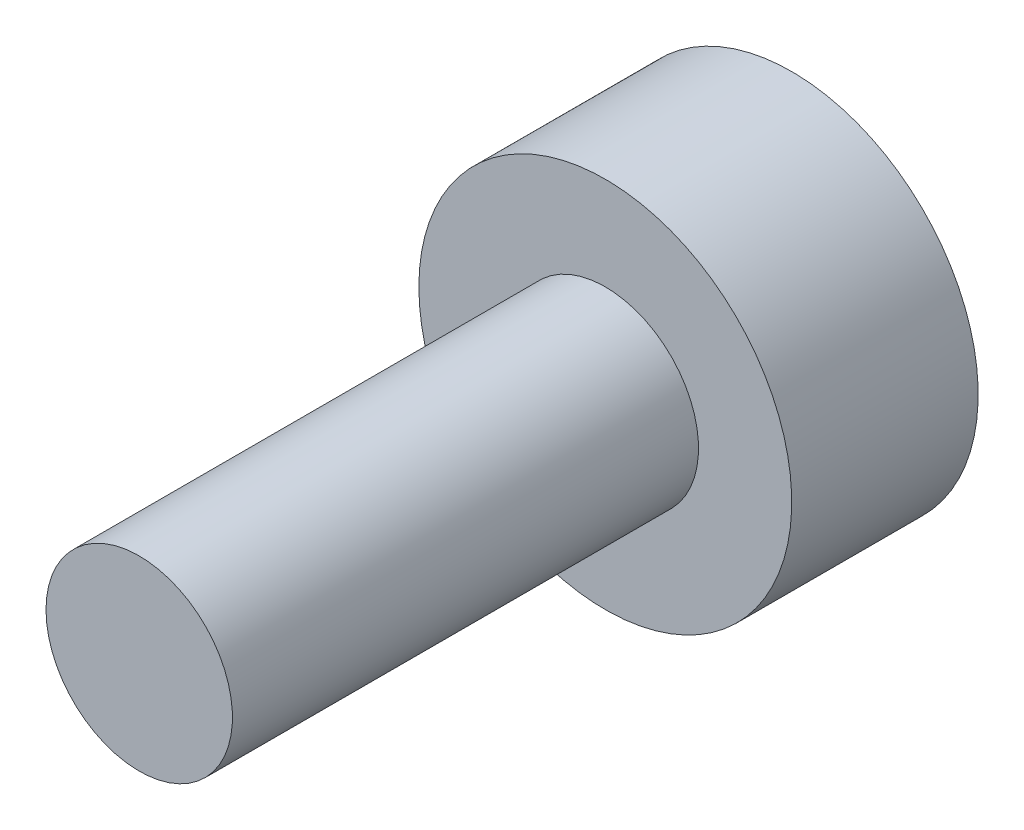
ISO-10303-21;
HEADER;
FILE_DESCRIPTION(('STEP AP214'),'2;1');
FILE_NAME('part.step','',(''),(''),'','','');
FILE_SCHEMA(('AUTOMOTIVE_DESIGN { 1 0 10303 214 1 1 1 1 }'));
ENDSEC;
DATA;
#1=APPLICATION_CONTEXT('core data for automotive mechanical design processes');
#2=APPLICATION_PROTOCOL_DEFINITION('international standard','automotive_design',2000,#1);
#3=PRODUCT_CONTEXT('',#1,'mechanical');
#4=PRODUCT('Part','Part','',(#3));
#5=PRODUCT_RELATED_PRODUCT_CATEGORY('part','',(#4));
#6=PRODUCT_DEFINITION_FORMATION('','',#4);
#7=PRODUCT_DEFINITION_CONTEXT('part definition',#1,'design');
#8=PRODUCT_DEFINITION('design','',#6,#7);
#9=PRODUCT_DEFINITION_SHAPE('','',#8);
#10=(LENGTH_UNIT() NAMED_UNIT(*) SI_UNIT(.MILLI.,.METRE.));
#11=(NAMED_UNIT(*) PLANE_ANGLE_UNIT() SI_UNIT($,.RADIAN.));
#12=(NAMED_UNIT(*) SI_UNIT($,.STERADIAN.) SOLID_ANGLE_UNIT());
#13=UNCERTAINTY_MEASURE_WITH_UNIT(LENGTH_MEASURE(1.E-05),#10,'distance_accuracy_value','');
#14=(GEOMETRIC_REPRESENTATION_CONTEXT(3) GLOBAL_UNCERTAINTY_ASSIGNED_CONTEXT((#13)) GLOBAL_UNIT_ASSIGNED_CONTEXT((#10,
#11,#12)) REPRESENTATION_CONTEXT('',''));
#15=CARTESIAN_POINT('',(0.,0.,0.));
#16=DIRECTION('',(0.,0.,1.));
#17=DIRECTION('',(1.,0.,0.));
#18=AXIS2_PLACEMENT_3D('',#15,#16,#17);
#19=CARTESIAN_POINT('',(0.,0.,0.));
#20=DIRECTION('',(0.,0.,-1.));
#21=DIRECTION('',(-1.,0.,0.));
#22=AXIS2_PLACEMENT_3D('',#19,#20,#21);
#23=PLANE('',#22);
#24=CARTESIAN_POINT('',(0.,0.,0.));
#25=DIRECTION('',(0.,0.,-1.));
#26=DIRECTION('',(-1.,0.,0.));
#27=AXIS2_PLACEMENT_3D('',#24,#25,#26);
#28=CIRCLE('',#27,1.);
#29=CARTESIAN_POINT('',(-1.,0.,0.));
#30=VERTEX_POINT('',#29);
#31=EDGE_CURVE('E11',#30,#30,#28,.T.);
#32=ORIENTED_EDGE('',*,*,#31,.F.);
#33=EDGE_LOOP('',(#32));
#34=FACE_BOUND('',#33,.T.);
#35=ADVANCED_FACE('F33',(#34),#23,.F.);
#36=CARTESIAN_POINT('',(0.,0.,-7.));
#37=DIRECTION('',(0.,0.,-1.));
#38=DIRECTION('',(-1.,0.,0.));
#39=AXIS2_PLACEMENT_3D('',#36,#37,#38);
#40=CYLINDRICAL_SURFACE('',#39,1.);
#41=CARTESIAN_POINT('',(0.,0.,-5.));
#42=DIRECTION('',(0.,0.,-1.));
#43=DIRECTION('',(-1.,0.,0.));
#44=AXIS2_PLACEMENT_3D('',#41,#42,#43);
#45=CIRCLE('',#44,0.999999999999999);
#46=CARTESIAN_POINT('',(-0.999999999999999,0.,-5.));
#47=VERTEX_POINT('',#46);
#48=EDGE_CURVE('E40',#47,#47,#45,.T.);
#49=ORIENTED_EDGE('',*,*,#48,.F.);
#50=EDGE_LOOP('',(#49));
#51=FACE_BOUND('',#50,.T.);
#52=ORIENTED_EDGE('',*,*,#31,.T.);
#53=EDGE_LOOP('',(#52));
#54=FACE_BOUND('',#53,.T.);
#55=ADVANCED_FACE('F149',(#51,#54),#40,.T.);
#56=CARTESIAN_POINT('',(1.,0.,-5.));
#57=DIRECTION('',(0.,0.,-1.));
#58=DIRECTION('',(-1.,0.,0.));
#59=AXIS2_PLACEMENT_3D('',#56,#57,#58);
#60=PLANE('',#59);
#61=CARTESIAN_POINT('',(0.,0.,-5.));
#62=DIRECTION('',(0.,0.,-1.));
#63=DIRECTION('',(-1.,0.,0.));
#64=AXIS2_PLACEMENT_3D('',#61,#62,#63);
#65=CIRCLE('',#64,2.);
#66=CARTESIAN_POINT('',(-2.,0.,-5.));
#67=VERTEX_POINT('',#66);
#68=EDGE_CURVE('E142',#67,#67,#65,.T.);
#69=ORIENTED_EDGE('',*,*,#68,.F.);
#70=EDGE_LOOP('',(#69));
#71=FACE_BOUND('',#70,.T.);
#72=ORIENTED_EDGE('',*,*,#48,.T.);
#73=EDGE_LOOP('',(#72));
#74=FACE_BOUND('',#73,.T.);
#75=ADVANCED_FACE('F147',(#71,#74),#60,.F.);
#76=CARTESIAN_POINT('',(0.,0.,-7.));
#77=DIRECTION('',(0.,0.,-1.));
#78=DIRECTION('',(-1.,0.,0.));
#79=AXIS2_PLACEMENT_3D('',#76,#77,#78);
#80=CYLINDRICAL_SURFACE('',#79,2.);
#81=CARTESIAN_POINT('',(0.,0.,-7.));
#82=DIRECTION('',(0.,0.,-1.));
#83=DIRECTION('',(-1.,0.,0.));
#84=AXIS2_PLACEMENT_3D('',#81,#82,#83);
#85=CIRCLE('',#84,2.);
#86=CARTESIAN_POINT('',(-2.,0.,-7.));
#87=VERTEX_POINT('',#86);
#88=EDGE_CURVE('E134',#87,#87,#85,.T.);
#89=ORIENTED_EDGE('',*,*,#88,.F.);
#90=EDGE_LOOP('',(#89));
#91=FACE_BOUND('',#90,.T.);
#92=ORIENTED_EDGE('',*,*,#68,.T.);
#93=EDGE_LOOP('',(#92));
#94=FACE_BOUND('',#93,.T.);
#95=ADVANCED_FACE('F167',(#91,#94),#80,.T.);
#96=CARTESIAN_POINT('',(2.,0.,-7.));
#97=DIRECTION('',(0.,0.,1.));
#98=DIRECTION('',(1.,0.,0.));
#99=AXIS2_PLACEMENT_3D('',#96,#97,#98);
#100=PLANE('',#99);
#101=DIRECTION('',(1.,0.,0.));
#102=VECTOR('',#101,1.);
#103=CARTESIAN_POINT('',(-0.433012701892218,0.75,-7.));
#104=LINE('',#103,#102);
#105=CARTESIAN_POINT('',(-0.433012701892218,0.75,-7.));
#106=VERTEX_POINT('',#105);
#107=CARTESIAN_POINT('',(0.43301270189222,0.75,-7.));
#108=VERTEX_POINT('',#107);
#109=EDGE_CURVE('E121',#106,#108,#104,.T.);
#110=ORIENTED_EDGE('',*,*,#109,.F.);
#111=DIRECTION('',(0.5,0.866025403784438,0.));
#112=VECTOR('',#111,1.);
#113=CARTESIAN_POINT('',(-0.866025403784438,0.,-7.));
#114=LINE('',#113,#112);
#115=CARTESIAN_POINT('',(-0.866025403784438,0.,-7.));
#116=VERTEX_POINT('',#115);
#117=EDGE_CURVE('E47',#116,#106,#114,.T.);
#118=ORIENTED_EDGE('',*,*,#117,.F.);
#119=DIRECTION('',(-0.5,0.866025403784439,0.));
#120=VECTOR('',#119,1.);
#121=CARTESIAN_POINT('',(-0.433012701892218,-0.75,-7.));
#122=LINE('',#121,#120);
#123=CARTESIAN_POINT('',(-0.433012701892218,-0.75,-7.));
#124=VERTEX_POINT('',#123);
#125=EDGE_CURVE('E130',#124,#116,#122,.T.);
#126=ORIENTED_EDGE('',*,*,#125,.F.);
#127=DIRECTION('',(-1.,0.,0.));
#128=VECTOR('',#127,1.);
#129=CARTESIAN_POINT('',(0.43301270189222,-0.75,-7.));
#130=LINE('',#129,#128);
#131=CARTESIAN_POINT('',(0.43301270189222,-0.75,-7.));
#132=VERTEX_POINT('',#131);
#133=EDGE_CURVE('E128',#132,#124,#130,.T.);
#134=ORIENTED_EDGE('',*,*,#133,.F.);
#135=DIRECTION('',(-0.5,-0.866025403784439,0.));
#136=VECTOR('',#135,1.);
#137=CARTESIAN_POINT('',(0.86602540378444,0.,-7.));
#138=LINE('',#137,#136);
#139=CARTESIAN_POINT('',(0.86602540378444,0.,-7.));
#140=VERTEX_POINT('',#139);
#141=EDGE_CURVE('E95',#140,#132,#138,.T.);
#142=ORIENTED_EDGE('',*,*,#141,.F.);
#143=DIRECTION('',(0.5,-0.866025403784439,0.));
#144=VECTOR('',#143,1.);
#145=CARTESIAN_POINT('',(0.43301270189222,0.75,-7.));
#146=LINE('',#145,#144);
#147=EDGE_CURVE('E124',#108,#140,#146,.T.);
#148=ORIENTED_EDGE('',*,*,#147,.F.);
#149=EDGE_LOOP('',(#110,#118,#126,#134,#142,#148));
#150=FACE_BOUND('',#149,.T.);
#151=ORIENTED_EDGE('',*,*,#88,.T.);
#152=EDGE_LOOP('',(#151));
#153=FACE_BOUND('',#152,.T.);
#154=ADVANCED_FACE('F175',(#150,#153),#100,.F.);
#155=CARTESIAN_POINT('',(-0.866025403784438,0.,-5.8));
#156=DIRECTION('',(-0.866025403784438,0.5,0.));
#157=DIRECTION('',(-0.5,-0.866025403784439,0.));
#158=AXIS2_PLACEMENT_3D('',#155,#156,#157);
#159=PLANE('',#158);
#160=ORIENTED_EDGE('',*,*,#117,.T.);
#161=DIRECTION('',(0.,0.,-1.));
#162=VECTOR('',#161,1.);
#163=CARTESIAN_POINT('',(-0.433012701892219,0.75,-5.8));
#164=LINE('',#163,#162);
#165=CARTESIAN_POINT('',(-0.433012701892219,0.75,-5.8));
#166=VERTEX_POINT('',#165);
#167=EDGE_CURVE('E77',#166,#106,#164,.T.);
#168=ORIENTED_EDGE('',*,*,#167,.F.);
#169=DIRECTION('',(0.5,0.866025403784438,0.));
#170=VECTOR('',#169,1.);
#171=CARTESIAN_POINT('',(-0.866025403784438,0.,-5.8));
#172=LINE('',#171,#170);
#173=CARTESIAN_POINT('',(-0.866025403784438,0.,-5.8));
#174=VERTEX_POINT('',#173);
#175=EDGE_CURVE('E132',#174,#166,#172,.T.);
#176=ORIENTED_EDGE('',*,*,#175,.F.);
#177=DIRECTION('',(0.,0.,-1.));
#178=VECTOR('',#177,1.);
#179=CARTESIAN_POINT('',(-0.866025403784438,0.,-5.8));
#180=LINE('',#179,#178);
#181=EDGE_CURVE('E55',#174,#116,#180,.T.);
#182=ORIENTED_EDGE('',*,*,#181,.T.);
#183=EDGE_LOOP('',(#160,#168,#176,#182));
#184=FACE_BOUND('',#183,.T.);
#185=ADVANCED_FACE('F183',(#184),#159,.F.);
#186=CARTESIAN_POINT('',(-0.433012701892219,-0.75,-5.8));
#187=DIRECTION('',(-0.866025403784439,-0.5,0.));
#188=DIRECTION('',(0.5,-0.866025403784439,0.));
#189=AXIS2_PLACEMENT_3D('',#186,#187,#188);
#190=PLANE('',#189);
#191=ORIENTED_EDGE('',*,*,#125,.T.);
#192=ORIENTED_EDGE('',*,*,#181,.F.);
#193=DIRECTION('',(-0.5,0.866025403784439,0.));
#194=VECTOR('',#193,1.);
#195=CARTESIAN_POINT('',(-0.433012701892219,-0.75,-5.8));
#196=LINE('',#195,#194);
#197=CARTESIAN_POINT('',(-0.433012701892219,-0.75,-5.8));
#198=VERTEX_POINT('',#197);
#199=EDGE_CURVE('E107',#198,#174,#196,.T.);
#200=ORIENTED_EDGE('',*,*,#199,.F.);
#201=DIRECTION('',(0.,0.,-1.));
#202=VECTOR('',#201,1.);
#203=CARTESIAN_POINT('',(-0.433012701892219,-0.75,-5.8));
#204=LINE('',#203,#202);
#205=EDGE_CURVE('E99',#198,#124,#204,.T.);
#206=ORIENTED_EDGE('',*,*,#205,.T.);
#207=EDGE_LOOP('',(#191,#192,#200,#206));
#208=FACE_BOUND('',#207,.T.);
#209=ADVANCED_FACE('F191',(#208),#190,.F.);
#210=CARTESIAN_POINT('',(0.43301270189222,-0.75,-5.8));
#211=DIRECTION('',(0.,-1.,0.));
#212=DIRECTION('',(0.,0.,-1.));
#213=AXIS2_PLACEMENT_3D('',#210,#211,#212);
#214=PLANE('',#213);
#215=ORIENTED_EDGE('',*,*,#133,.T.);
#216=ORIENTED_EDGE('',*,*,#205,.F.);
#217=DIRECTION('',(-1.,0.,0.));
#218=VECTOR('',#217,1.);
#219=CARTESIAN_POINT('',(0.43301270189222,-0.75,-5.8));
#220=LINE('',#219,#218);
#221=CARTESIAN_POINT('',(0.43301270189222,-0.75,-5.8));
#222=VERTEX_POINT('',#221);
#223=EDGE_CURVE('E103',#222,#198,#220,.T.);
#224=ORIENTED_EDGE('',*,*,#223,.F.);
#225=DIRECTION('',(0.,0.,-1.));
#226=VECTOR('',#225,1.);
#227=CARTESIAN_POINT('',(0.43301270189222,-0.75,-5.8));
#228=LINE('',#227,#226);
#229=EDGE_CURVE('E88',#222,#132,#228,.T.);
#230=ORIENTED_EDGE('',*,*,#229,.T.);
#231=EDGE_LOOP('',(#215,#216,#224,#230));
#232=FACE_BOUND('',#231,.T.);
#233=ADVANCED_FACE('F104',(#232),#214,.F.);
#234=CARTESIAN_POINT('',(0.866025403784439,0.,-5.8));
#235=DIRECTION('',(0.866025403784439,-0.5,0.));
#236=DIRECTION('',(0.5,0.866025403784439,0.));
#237=AXIS2_PLACEMENT_3D('',#234,#235,#236);
#238=PLANE('',#237);
#239=ORIENTED_EDGE('',*,*,#141,.T.);
#240=ORIENTED_EDGE('',*,*,#229,.F.);
#241=DIRECTION('',(-0.5,-0.866025403784439,0.));
#242=VECTOR('',#241,1.);
#243=CARTESIAN_POINT('',(0.866025403784439,0.,-5.8));
#244=LINE('',#243,#242);
#245=CARTESIAN_POINT('',(0.866025403784439,0.,-5.8));
#246=VERTEX_POINT('',#245);
#247=EDGE_CURVE('E92',#246,#222,#244,.T.);
#248=ORIENTED_EDGE('',*,*,#247,.F.);
#249=DIRECTION('',(0.,0.,-1.));
#250=VECTOR('',#249,1.);
#251=CARTESIAN_POINT('',(0.866025403784439,0.,-5.8));
#252=LINE('',#251,#250);
#253=EDGE_CURVE('E100',#246,#140,#252,.T.);
#254=ORIENTED_EDGE('',*,*,#253,.T.);
#255=EDGE_LOOP('',(#239,#240,#248,#254));
#256=FACE_BOUND('',#255,.T.);
#257=ADVANCED_FACE('F90',(#256),#238,.F.);
#258=CARTESIAN_POINT('',(0.43301270189222,0.75,-5.8));
#259=DIRECTION('',(0.866025403784439,0.5,0.));
#260=DIRECTION('',(-0.5,0.866025403784439,0.));
#261=AXIS2_PLACEMENT_3D('',#258,#259,#260);
#262=PLANE('',#261);
#263=ORIENTED_EDGE('',*,*,#147,.T.);
#264=ORIENTED_EDGE('',*,*,#253,.F.);
#265=DIRECTION('',(0.5,-0.866025403784439,0.));
#266=VECTOR('',#265,1.);
#267=CARTESIAN_POINT('',(0.43301270189222,0.75,-5.8));
#268=LINE('',#267,#266);
#269=CARTESIAN_POINT('',(0.43301270189222,0.75,-5.8));
#270=VERTEX_POINT('',#269);
#271=EDGE_CURVE('E113',#270,#246,#268,.T.);
#272=ORIENTED_EDGE('',*,*,#271,.F.);
#273=DIRECTION('',(0.,0.,-1.));
#274=VECTOR('',#273,1.);
#275=CARTESIAN_POINT('',(0.43301270189222,0.75,-5.8));
#276=LINE('',#275,#274);
#277=EDGE_CURVE('E137',#270,#108,#276,.T.);
#278=ORIENTED_EDGE('',*,*,#277,.T.);
#279=EDGE_LOOP('',(#263,#264,#272,#278));
#280=FACE_BOUND('',#279,.T.);
#281=ADVANCED_FACE('F210',(#280),#262,.F.);
#282=CARTESIAN_POINT('',(-0.433012701892219,0.75,-5.8));
#283=DIRECTION('',(0.,1.,0.));
#284=DIRECTION('',(-1.,0.,0.));
#285=AXIS2_PLACEMENT_3D('',#282,#283,#284);
#286=PLANE('',#285);
#287=ORIENTED_EDGE('',*,*,#109,.T.);
#288=ORIENTED_EDGE('',*,*,#277,.F.);
#289=DIRECTION('',(1.,0.,0.));
#290=VECTOR('',#289,1.);
#291=CARTESIAN_POINT('',(-0.433012701892219,0.75,-5.8));
#292=LINE('',#291,#290);
#293=EDGE_CURVE('E115',#166,#270,#292,.T.);
#294=ORIENTED_EDGE('',*,*,#293,.F.);
#295=ORIENTED_EDGE('',*,*,#167,.T.);
#296=EDGE_LOOP('',(#287,#288,#294,#295));
#297=FACE_BOUND('',#296,.T.);
#298=ADVANCED_FACE('F217',(#297),#286,.F.);
#299=CARTESIAN_POINT('',(0.,0.,-5.8));
#300=DIRECTION('',(0.,0.,-1.));
#301=DIRECTION('',(-1.,0.,0.));
#302=AXIS2_PLACEMENT_3D('',#299,#300,#301);
#303=PLANE('',#302);
#304=ORIENTED_EDGE('',*,*,#175,.T.);
#305=ORIENTED_EDGE('',*,*,#293,.T.);
#306=ORIENTED_EDGE('',*,*,#271,.T.);
#307=ORIENTED_EDGE('',*,*,#247,.T.);
#308=ORIENTED_EDGE('',*,*,#223,.T.);
#309=ORIENTED_EDGE('',*,*,#199,.T.);
#310=EDGE_LOOP('',(#304,#305,#306,#307,#308,#309));
#311=FACE_BOUND('',#310,.T.);
#312=ADVANCED_FACE('F110',(#311),#303,.T.);
#313=CLOSED_SHELL('',(#35,#55,#75,#95,#154,#185,#209,#233,#257,#281,#298,#312));
#314=MANIFOLD_SOLID_BREP('B2',#313);
#315=ADVANCED_BREP_SHAPE_REPRESENTATION('',(#18,#314),#14);
#316=SHAPE_DEFINITION_REPRESENTATION(#9,#315);
ENDSEC;
END-ISO-10303-21;
